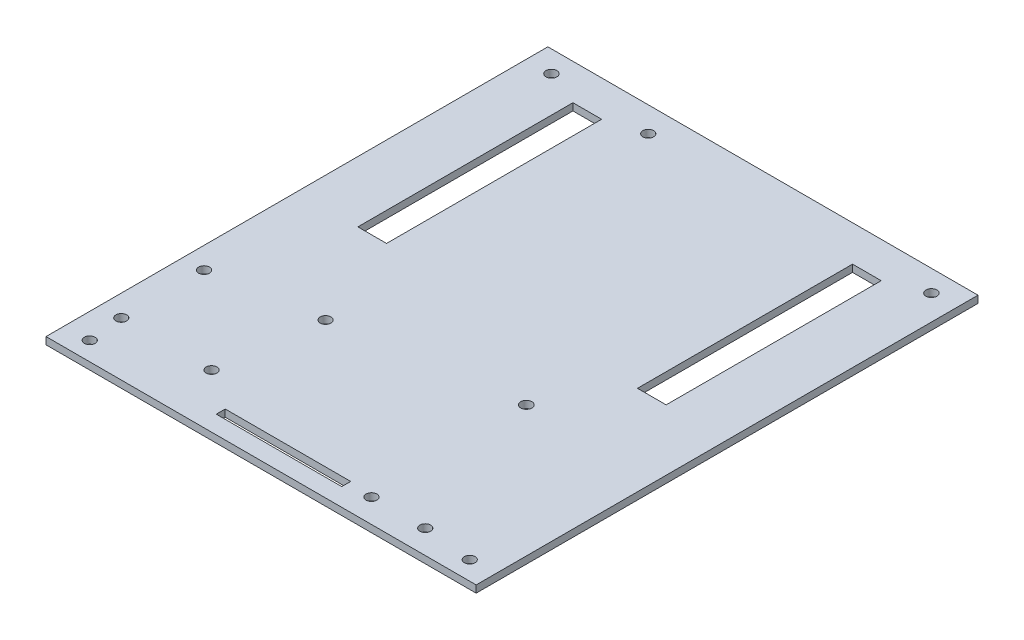
ISO-10303-21;
HEADER;
FILE_DESCRIPTION(('STEP AP214'),'2;1');
FILE_NAME('part.step','',(''),(''),'','','');
FILE_SCHEMA(('AUTOMOTIVE_DESIGN { 1 0 10303 214 1 1 1 1 }'));
ENDSEC;
DATA;
#1=APPLICATION_CONTEXT('core data for automotive mechanical design processes');
#2=APPLICATION_PROTOCOL_DEFINITION('international standard','automotive_design',2000,#1);
#3=PRODUCT_CONTEXT('',#1,'mechanical');
#4=PRODUCT('Part','Part','',(#3));
#5=PRODUCT_RELATED_PRODUCT_CATEGORY('part','',(#4));
#6=PRODUCT_DEFINITION_FORMATION('','',#4);
#7=PRODUCT_DEFINITION_CONTEXT('part definition',#1,'design');
#8=PRODUCT_DEFINITION('design','',#6,#7);
#9=PRODUCT_DEFINITION_SHAPE('','',#8);
#10=(LENGTH_UNIT() NAMED_UNIT(*) SI_UNIT(.MILLI.,.METRE.));
#11=(NAMED_UNIT(*) PLANE_ANGLE_UNIT() SI_UNIT($,.RADIAN.));
#12=(NAMED_UNIT(*) SI_UNIT($,.STERADIAN.) SOLID_ANGLE_UNIT());
#13=UNCERTAINTY_MEASURE_WITH_UNIT(LENGTH_MEASURE(1.E-05),#10,'distance_accuracy_value','');
#14=(GEOMETRIC_REPRESENTATION_CONTEXT(3) GLOBAL_UNCERTAINTY_ASSIGNED_CONTEXT((#13)) GLOBAL_UNIT_ASSIGNED_CONTEXT((#10,
#11,#12)) REPRESENTATION_CONTEXT('',''));
#15=CARTESIAN_POINT('',(0.,0.,0.));
#16=DIRECTION('',(0.,0.,1.));
#17=DIRECTION('',(1.,0.,0.));
#18=AXIS2_PLACEMENT_3D('',#15,#16,#17);
#19=CARTESIAN_POINT('',(-60.,2.,70.));
#20=DIRECTION('',(1.,0.,0.));
#21=DIRECTION('',(0.,0.,-1.));
#22=AXIS2_PLACEMENT_3D('',#19,#20,#21);
#23=PLANE('',#22);
#24=DIRECTION('',(0.,0.,1.));
#25=VECTOR('',#24,1.);
#26=CARTESIAN_POINT('',(-60.,0.,70.));
#27=LINE('',#26,#25);
#28=CARTESIAN_POINT('',(-60.,0.,-70.));
#29=VERTEX_POINT('',#28);
#30=CARTESIAN_POINT('',(-60.,0.,70.));
#31=VERTEX_POINT('',#30);
#32=EDGE_CURVE('E312',#29,#31,#27,.T.);
#33=ORIENTED_EDGE('',*,*,#32,.T.);
#34=DIRECTION('',(0.,-1.,0.));
#35=VECTOR('',#34,1.);
#36=CARTESIAN_POINT('',(-60.,2.,70.));
#37=LINE('',#36,#35);
#38=CARTESIAN_POINT('',(-60.,2.,70.));
#39=VERTEX_POINT('',#38);
#40=EDGE_CURVE('E11',#39,#31,#37,.T.);
#41=ORIENTED_EDGE('',*,*,#40,.F.);
#42=DIRECTION('',(0.,0.,1.));
#43=VECTOR('',#42,1.);
#44=CARTESIAN_POINT('',(-60.,2.,70.));
#45=LINE('',#44,#43);
#46=CARTESIAN_POINT('',(-60.,2.,-70.));
#47=VERTEX_POINT('',#46);
#48=EDGE_CURVE('E315',#47,#39,#45,.T.);
#49=ORIENTED_EDGE('',*,*,#48,.F.);
#50=DIRECTION('',(0.,-1.,0.));
#51=VECTOR('',#50,1.);
#52=CARTESIAN_POINT('',(-60.,2.,-70.));
#53=LINE('',#52,#51);
#54=EDGE_CURVE('E325',#47,#29,#53,.T.);
#55=ORIENTED_EDGE('',*,*,#54,.T.);
#56=EDGE_LOOP('',(#33,#41,#49,#55));
#57=FACE_BOUND('',#56,.T.);
#58=ADVANCED_FACE('F38',(#57),#23,.F.);
#59=CARTESIAN_POINT('',(60.,2.,70.));
#60=DIRECTION('',(0.,0.,-1.));
#61=DIRECTION('',(-1.,0.,0.));
#62=AXIS2_PLACEMENT_3D('',#59,#60,#61);
#63=PLANE('',#62);
#64=DIRECTION('',(1.,0.,0.));
#65=VECTOR('',#64,1.);
#66=CARTESIAN_POINT('',(60.,0.,70.));
#67=LINE('',#66,#65);
#68=CARTESIAN_POINT('',(60.,0.,70.));
#69=VERTEX_POINT('',#68);
#70=EDGE_CURVE('E328',#31,#69,#67,.T.);
#71=ORIENTED_EDGE('',*,*,#70,.T.);
#72=DIRECTION('',(0.,-1.,0.));
#73=VECTOR('',#72,1.);
#74=CARTESIAN_POINT('',(60.,2.,70.));
#75=LINE('',#74,#73);
#76=CARTESIAN_POINT('',(60.,2.,70.));
#77=VERTEX_POINT('',#76);
#78=EDGE_CURVE('E45',#77,#69,#75,.T.);
#79=ORIENTED_EDGE('',*,*,#78,.F.);
#80=DIRECTION('',(1.,0.,0.));
#81=VECTOR('',#80,1.);
#82=CARTESIAN_POINT('',(60.,2.,70.));
#83=LINE('',#82,#81);
#84=EDGE_CURVE('E318',#39,#77,#83,.T.);
#85=ORIENTED_EDGE('',*,*,#84,.F.);
#86=ORIENTED_EDGE('',*,*,#40,.T.);
#87=EDGE_LOOP('',(#71,#79,#85,#86));
#88=FACE_BOUND('',#87,.T.);
#89=ADVANCED_FACE('F357',(#88),#63,.F.);
#90=CARTESIAN_POINT('',(60.,2.,70.));
#91=DIRECTION('',(-1.,0.,0.));
#92=DIRECTION('',(0.,0.,1.));
#93=AXIS2_PLACEMENT_3D('',#90,#91,#92);
#94=PLANE('',#93);
#95=DIRECTION('',(0.,0.,-1.));
#96=VECTOR('',#95,1.);
#97=CARTESIAN_POINT('',(60.,0.,70.));
#98=LINE('',#97,#96);
#99=CARTESIAN_POINT('',(60.,0.,-70.));
#100=VERTEX_POINT('',#99);
#101=EDGE_CURVE('E330',#69,#100,#98,.T.);
#102=ORIENTED_EDGE('',*,*,#101,.T.);
#103=DIRECTION('',(0.,-1.,0.));
#104=VECTOR('',#103,1.);
#105=CARTESIAN_POINT('',(60.,2.,-70.));
#106=LINE('',#105,#104);
#107=CARTESIAN_POINT('',(60.,2.,-70.));
#108=VERTEX_POINT('',#107);
#109=EDGE_CURVE('E335',#108,#100,#106,.T.);
#110=ORIENTED_EDGE('',*,*,#109,.F.);
#111=DIRECTION('',(0.,0.,-1.));
#112=VECTOR('',#111,1.);
#113=CARTESIAN_POINT('',(60.,2.,70.));
#114=LINE('',#113,#112);
#115=EDGE_CURVE('E321',#77,#108,#114,.T.);
#116=ORIENTED_EDGE('',*,*,#115,.F.);
#117=ORIENTED_EDGE('',*,*,#78,.T.);
#118=EDGE_LOOP('',(#102,#110,#116,#117));
#119=FACE_BOUND('',#118,.T.);
#120=ADVANCED_FACE('F342',(#119),#94,.F.);
#121=CARTESIAN_POINT('',(60.,2.,-70.));
#122=DIRECTION('',(0.,0.,1.));
#123=DIRECTION('',(1.,0.,0.));
#124=AXIS2_PLACEMENT_3D('',#121,#122,#123);
#125=PLANE('',#124);
#126=DIRECTION('',(-1.,0.,0.));
#127=VECTOR('',#126,1.);
#128=CARTESIAN_POINT('',(60.,0.,-70.));
#129=LINE('',#128,#127);
#130=EDGE_CURVE('E319',#100,#29,#129,.T.);
#131=ORIENTED_EDGE('',*,*,#130,.T.);
#132=ORIENTED_EDGE('',*,*,#54,.F.);
#133=DIRECTION('',(-1.,0.,0.));
#134=VECTOR('',#133,1.);
#135=CARTESIAN_POINT('',(60.,2.,-70.));
#136=LINE('',#135,#134);
#137=EDGE_CURVE('E323',#108,#47,#136,.T.);
#138=ORIENTED_EDGE('',*,*,#137,.F.);
#139=ORIENTED_EDGE('',*,*,#109,.T.);
#140=EDGE_LOOP('',(#131,#132,#138,#139));
#141=FACE_BOUND('',#140,.T.);
#142=ADVANCED_FACE('F350',(#141),#125,.F.);
#143=CARTESIAN_POINT('',(0.,2.,0.));
#144=DIRECTION('',(0.,1.,0.));
#145=DIRECTION('',(0.,0.,1.));
#146=AXIS2_PLACEMENT_3D('',#143,#144,#145);
#147=PLANE('',#146);
#148=CARTESIAN_POINT('',(39.1835613736994,2.,63.3826398099015));
#149=DIRECTION('',(0.,1.,0.));
#150=DIRECTION('',(0.,0.,1.));
#151=AXIS2_PLACEMENT_3D('',#148,#149,#150);
#152=CIRCLE('',#151,1.5);
#153=CARTESIAN_POINT('',(39.1835613736994,2.,64.8826398099015));
#154=VERTEX_POINT('',#153);
#155=EDGE_CURVE('E471',#154,#154,#152,.T.);
#156=ORIENTED_EDGE('',*,*,#155,.F.);
#157=EDGE_LOOP('',(#156));
#158=FACE_BOUND('',#157,.T.);
#159=CARTESIAN_POINT('',(24.1835613736994,2.,63.3826398099015));
#160=DIRECTION('',(0.,1.,0.));
#161=DIRECTION('',(0.,0.,1.));
#162=AXIS2_PLACEMENT_3D('',#159,#160,#161);
#163=CIRCLE('',#162,1.5);
#164=CARTESIAN_POINT('',(24.1835613736994,2.,64.8826398099015));
#165=VERTEX_POINT('',#164);
#166=EDGE_CURVE('E174',#165,#165,#163,.T.);
#167=ORIENTED_EDGE('',*,*,#166,.F.);
#168=EDGE_LOOP('',(#167));
#169=FACE_BOUND('',#168,.T.);
#170=DIRECTION('',(0.,0.,1.));
#171=VECTOR('',#170,1.);
#172=CARTESIAN_POINT('',(-17.5,2.,65.));
#173=LINE('',#172,#171);
#174=CARTESIAN_POINT('',(-17.5,2.,62.5));
#175=VERTEX_POINT('',#174);
#176=CARTESIAN_POINT('',(-17.5,2.,65.));
#177=VERTEX_POINT('',#176);
#178=EDGE_CURVE('E52',#175,#177,#173,.T.);
#179=ORIENTED_EDGE('',*,*,#178,.F.);
#180=DIRECTION('',(-1.,0.,0.));
#181=VECTOR('',#180,1.);
#182=CARTESIAN_POINT('',(17.5,2.,62.5));
#183=LINE('',#182,#181);
#184=CARTESIAN_POINT('',(17.5,2.,62.5));
#185=VERTEX_POINT('',#184);
#186=EDGE_CURVE('E168',#185,#175,#183,.T.);
#187=ORIENTED_EDGE('',*,*,#186,.F.);
#188=DIRECTION('',(0.,0.,-1.));
#189=VECTOR('',#188,1.);
#190=CARTESIAN_POINT('',(17.5,2.,65.));
#191=LINE('',#190,#189);
#192=CARTESIAN_POINT('',(17.5,2.,65.));
#193=VERTEX_POINT('',#192);
#194=EDGE_CURVE('E171',#193,#185,#191,.T.);
#195=ORIENTED_EDGE('',*,*,#194,.F.);
#196=DIRECTION('',(1.,0.,0.));
#197=VECTOR('',#196,1.);
#198=CARTESIAN_POINT('',(17.5,2.,65.));
#199=LINE('',#198,#197);
#200=EDGE_CURVE('E180',#177,#193,#199,.T.);
#201=ORIENTED_EDGE('',*,*,#200,.F.);
#202=EDGE_LOOP('',(#179,#187,#195,#201));
#203=FACE_BOUND('',#202,.T.);
#204=CARTESIAN_POINT('',(-54.,2.,31.9));
#205=DIRECTION('',(0.,1.,0.));
#206=DIRECTION('',(0.,0.,1.));
#207=AXIS2_PLACEMENT_3D('',#204,#205,#206);
#208=CIRCLE('',#207,1.5);
#209=CARTESIAN_POINT('',(-54.,2.,33.4));
#210=VERTEX_POINT('',#209);
#211=EDGE_CURVE('E187',#210,#210,#208,.T.);
#212=ORIENTED_EDGE('',*,*,#211,.F.);
#213=EDGE_LOOP('',(#212));
#214=FACE_BOUND('',#213,.T.);
#215=CARTESIAN_POINT('',(-28.82,2.,55.));
#216=DIRECTION('',(0.,1.,0.));
#217=DIRECTION('',(0.,0.,1.));
#218=AXIS2_PLACEMENT_3D('',#215,#216,#217);
#219=CIRCLE('',#218,1.5);
#220=CARTESIAN_POINT('',(-28.82,2.,56.5));
#221=VERTEX_POINT('',#220);
#222=EDGE_CURVE('E194',#221,#221,#219,.T.);
#223=ORIENTED_EDGE('',*,*,#222,.F.);
#224=EDGE_LOOP('',(#223));
#225=FACE_BOUND('',#224,.T.);
#226=CARTESIAN_POINT('',(-54.,2.,55.));
#227=DIRECTION('',(0.,1.,0.));
#228=DIRECTION('',(0.,0.,1.));
#229=AXIS2_PLACEMENT_3D('',#226,#227,#228);
#230=CIRCLE('',#229,1.5);
#231=CARTESIAN_POINT('',(-54.,2.,56.5));
#232=VERTEX_POINT('',#231);
#233=EDGE_CURVE('E200',#232,#232,#230,.T.);
#234=ORIENTED_EDGE('',*,*,#233,.F.);
#235=EDGE_LOOP('',(#234));
#236=FACE_BOUND('',#235,.T.);
#237=DIRECTION('',(0.,0.,1.));
#238=VECTOR('',#237,1.);
#239=CARTESIAN_POINT('',(35.,2.,-60.));
#240=LINE('',#239,#238);
#241=CARTESIAN_POINT('',(35.,2.,-60.));
#242=VERTEX_POINT('',#241);
#243=CARTESIAN_POINT('',(35.,2.,0.));
#244=VERTEX_POINT('',#243);
#245=EDGE_CURVE('E206',#242,#244,#240,.T.);
#246=ORIENTED_EDGE('',*,*,#245,.F.);
#247=DIRECTION('',(-1.,0.,0.));
#248=VECTOR('',#247,1.);
#249=CARTESIAN_POINT('',(35.,2.,-60.));
#250=LINE('',#249,#248);
#251=CARTESIAN_POINT('',(43.,2.,-60.));
#252=VERTEX_POINT('',#251);
#253=EDGE_CURVE('E213',#252,#242,#250,.T.);
#254=ORIENTED_EDGE('',*,*,#253,.F.);
#255=DIRECTION('',(0.,0.,-1.));
#256=VECTOR('',#255,1.);
#257=CARTESIAN_POINT('',(43.,2.,-60.));
#258=LINE('',#257,#256);
#259=CARTESIAN_POINT('',(43.,2.,0.));
#260=VERTEX_POINT('',#259);
#261=EDGE_CURVE('E227',#260,#252,#258,.T.);
#262=ORIENTED_EDGE('',*,*,#261,.F.);
#263=DIRECTION('',(1.,0.,0.));
#264=VECTOR('',#263,1.);
#265=CARTESIAN_POINT('',(35.,2.,0.));
#266=LINE('',#265,#264);
#267=EDGE_CURVE('E224',#244,#260,#266,.T.);
#268=ORIENTED_EDGE('',*,*,#267,.F.);
#269=EDGE_LOOP('',(#246,#254,#262,#268));
#270=FACE_BOUND('',#269,.T.);
#271=DIRECTION('',(0.,0.,1.));
#272=VECTOR('',#271,1.);
#273=CARTESIAN_POINT('',(-43.,2.,-60.));
#274=LINE('',#273,#272);
#275=CARTESIAN_POINT('',(-43.,2.,-60.));
#276=VERTEX_POINT('',#275);
#277=CARTESIAN_POINT('',(-43.,2.,0.));
#278=VERTEX_POINT('',#277);
#279=EDGE_CURVE('E234',#276,#278,#274,.T.);
#280=ORIENTED_EDGE('',*,*,#279,.F.);
#281=DIRECTION('',(-1.,0.,0.));
#282=VECTOR('',#281,1.);
#283=CARTESIAN_POINT('',(-35.,2.,-60.));
#284=LINE('',#283,#282);
#285=CARTESIAN_POINT('',(-35.,2.,-60.));
#286=VERTEX_POINT('',#285);
#287=EDGE_CURVE('E245',#286,#276,#284,.T.);
#288=ORIENTED_EDGE('',*,*,#287,.F.);
#289=DIRECTION('',(0.,0.,-1.));
#290=VECTOR('',#289,1.);
#291=CARTESIAN_POINT('',(-35.,2.,-60.));
#292=LINE('',#291,#290);
#293=CARTESIAN_POINT('',(-35.,2.,0.));
#294=VERTEX_POINT('',#293);
#295=EDGE_CURVE('E259',#294,#286,#292,.T.);
#296=ORIENTED_EDGE('',*,*,#295,.F.);
#297=DIRECTION('',(1.,0.,0.));
#298=VECTOR('',#297,1.);
#299=CARTESIAN_POINT('',(-35.,2.,0.));
#300=LINE('',#299,#298);
#301=EDGE_CURVE('E256',#278,#294,#300,.T.);
#302=ORIENTED_EDGE('',*,*,#301,.F.);
#303=EDGE_LOOP('',(#280,#288,#296,#302));
#304=FACE_BOUND('',#303,.T.);
#305=CARTESIAN_POINT('',(23.5,2.,19.5));
#306=DIRECTION('',(0.,1.,0.));
#307=DIRECTION('',(0.,0.,1.));
#308=AXIS2_PLACEMENT_3D('',#305,#306,#307);
#309=CIRCLE('',#308,1.55);
#310=CARTESIAN_POINT('',(23.5,2.,21.05));
#311=VERTEX_POINT('',#310);
#312=EDGE_CURVE('E266',#311,#311,#309,.T.);
#313=ORIENTED_EDGE('',*,*,#312,.F.);
#314=EDGE_LOOP('',(#313));
#315=FACE_BOUND('',#314,.T.);
#316=CARTESIAN_POINT('',(-25.,2.,27.));
#317=DIRECTION('',(0.,1.,0.));
#318=DIRECTION('',(0.,0.,1.));
#319=AXIS2_PLACEMENT_3D('',#316,#317,#318);
#320=CIRCLE('',#319,1.5);
#321=CARTESIAN_POINT('',(-25.,2.,28.5));
#322=VERTEX_POINT('',#321);
#323=EDGE_CURVE('E276',#322,#322,#320,.T.);
#324=ORIENTED_EDGE('',*,*,#323,.F.);
#325=EDGE_LOOP('',(#324));
#326=FACE_BOUND('',#325,.T.);
#327=CARTESIAN_POINT('',(-25.,2.,-63.));
#328=DIRECTION('',(0.,1.,0.));
#329=DIRECTION('',(0.,0.,1.));
#330=AXIS2_PLACEMENT_3D('',#327,#328,#329);
#331=CIRCLE('',#330,1.5);
#332=CARTESIAN_POINT('',(-25.,2.,-61.5));
#333=VERTEX_POINT('',#332);
#334=EDGE_CURVE('E282',#333,#333,#331,.T.);
#335=ORIENTED_EDGE('',*,*,#334,.F.);
#336=EDGE_LOOP('',(#335));
#337=FACE_BOUND('',#336,.T.);
#338=CARTESIAN_POINT('',(53.,2.,64.8));
#339=DIRECTION('',(0.,1.,0.));
#340=DIRECTION('',(0.,0.,-1.));
#341=AXIS2_PLACEMENT_3D('',#338,#339,#340);
#342=CIRCLE('',#341,1.5);
#343=CARTESIAN_POINT('',(53.,2.,63.3));
#344=VERTEX_POINT('',#343);
#345=EDGE_CURVE('E288',#344,#344,#342,.T.);
#346=ORIENTED_EDGE('',*,*,#345,.F.);
#347=EDGE_LOOP('',(#346));
#348=FACE_BOUND('',#347,.T.);
#349=CARTESIAN_POINT('',(53.,2.,-64.));
#350=DIRECTION('',(0.,1.,0.));
#351=DIRECTION('',(0.,0.,-1.));
#352=AXIS2_PLACEMENT_3D('',#349,#350,#351);
#353=CIRCLE('',#352,1.525);
#354=CARTESIAN_POINT('',(53.,2.,-65.525));
#355=VERTEX_POINT('',#354);
#356=EDGE_CURVE('E294',#355,#355,#353,.T.);
#357=ORIENTED_EDGE('',*,*,#356,.F.);
#358=EDGE_LOOP('',(#357));
#359=FACE_BOUND('',#358,.T.);
#360=CARTESIAN_POINT('',(-53.,2.,64.8));
#361=DIRECTION('',(0.,1.,0.));
#362=DIRECTION('',(0.,0.,1.));
#363=AXIS2_PLACEMENT_3D('',#360,#361,#362);
#364=CIRCLE('',#363,1.5);
#365=CARTESIAN_POINT('',(-53.,2.,66.3));
#366=VERTEX_POINT('',#365);
#367=EDGE_CURVE('E300',#366,#366,#364,.T.);
#368=ORIENTED_EDGE('',*,*,#367,.F.);
#369=EDGE_LOOP('',(#368));
#370=FACE_BOUND('',#369,.T.);
#371=CARTESIAN_POINT('',(-53.,2.,-64.));
#372=DIRECTION('',(0.,1.,0.));
#373=DIRECTION('',(0.,0.,1.));
#374=AXIS2_PLACEMENT_3D('',#371,#372,#373);
#375=CIRCLE('',#374,1.525);
#376=CARTESIAN_POINT('',(-53.,2.,-62.475));
#377=VERTEX_POINT('',#376);
#378=EDGE_CURVE('E306',#377,#377,#375,.T.);
#379=ORIENTED_EDGE('',*,*,#378,.F.);
#380=EDGE_LOOP('',(#379));
#381=FACE_BOUND('',#380,.T.);
#382=ORIENTED_EDGE('',*,*,#48,.T.);
#383=ORIENTED_EDGE('',*,*,#84,.T.);
#384=ORIENTED_EDGE('',*,*,#115,.T.);
#385=ORIENTED_EDGE('',*,*,#137,.T.);
#386=EDGE_LOOP('',(#382,#383,#384,#385));
#387=FACE_BOUND('',#386,.T.);
#388=ADVANCED_FACE('F356',(#158,#169,#203,#214,#225,#236,#270,#304,#315,#326,#337,#348,#359,
#370,#381,#387),#147,.T.);
#389=CARTESIAN_POINT('',(0.,0.,0.));
#390=DIRECTION('',(0.,1.,0.));
#391=DIRECTION('',(0.,0.,1.));
#392=AXIS2_PLACEMENT_3D('',#389,#390,#391);
#393=PLANE('',#392);
#394=CARTESIAN_POINT('',(39.1835613736994,0.,63.3826398099015));
#395=DIRECTION('',(0.,1.,0.));
#396=DIRECTION('',(0.,0.,1.));
#397=AXIS2_PLACEMENT_3D('',#394,#395,#396);
#398=CIRCLE('',#397,1.5);
#399=CARTESIAN_POINT('',(39.1835613736994,0.,64.8826398099015));
#400=VERTEX_POINT('',#399);
#401=EDGE_CURVE('E468',#400,#400,#398,.T.);
#402=ORIENTED_EDGE('',*,*,#401,.T.);
#403=EDGE_LOOP('',(#402));
#404=FACE_BOUND('',#403,.T.);
#405=CARTESIAN_POINT('',(24.1835613736994,0.,63.3826398099015));
#406=DIRECTION('',(0.,1.,0.));
#407=DIRECTION('',(0.,0.,1.));
#408=AXIS2_PLACEMENT_3D('',#405,#406,#407);
#409=CIRCLE('',#408,1.5);
#410=CARTESIAN_POINT('',(24.1835613736994,0.,64.8826398099015));
#411=VERTEX_POINT('',#410);
#412=EDGE_CURVE('E181',#411,#411,#409,.T.);
#413=ORIENTED_EDGE('',*,*,#412,.T.);
#414=EDGE_LOOP('',(#413));
#415=FACE_BOUND('',#414,.T.);
#416=DIRECTION('',(-1.,0.,0.));
#417=VECTOR('',#416,1.);
#418=CARTESIAN_POINT('',(17.5,0.,62.5));
#419=LINE('',#418,#417);
#420=CARTESIAN_POINT('',(17.5,0.,62.5));
#421=VERTEX_POINT('',#420);
#422=CARTESIAN_POINT('',(-17.5,0.,62.5));
#423=VERTEX_POINT('',#422);
#424=EDGE_CURVE('E158',#421,#423,#419,.T.);
#425=ORIENTED_EDGE('',*,*,#424,.T.);
#426=DIRECTION('',(0.,0.,1.));
#427=VECTOR('',#426,1.);
#428=CARTESIAN_POINT('',(-17.5,0.,65.));
#429=LINE('',#428,#427);
#430=CARTESIAN_POINT('',(-17.5,0.,65.));
#431=VERTEX_POINT('',#430);
#432=EDGE_CURVE('E152',#423,#431,#429,.T.);
#433=ORIENTED_EDGE('',*,*,#432,.T.);
#434=DIRECTION('',(1.,0.,0.));
#435=VECTOR('',#434,1.);
#436=CARTESIAN_POINT('',(17.5,0.,65.));
#437=LINE('',#436,#435);
#438=CARTESIAN_POINT('',(17.5,0.,65.));
#439=VERTEX_POINT('',#438);
#440=EDGE_CURVE('E161',#431,#439,#437,.T.);
#441=ORIENTED_EDGE('',*,*,#440,.T.);
#442=DIRECTION('',(0.,0.,-1.));
#443=VECTOR('',#442,1.);
#444=CARTESIAN_POINT('',(17.5,0.,65.));
#445=LINE('',#444,#443);
#446=EDGE_CURVE('E60',#439,#421,#445,.T.);
#447=ORIENTED_EDGE('',*,*,#446,.T.);
#448=EDGE_LOOP('',(#425,#433,#441,#447));
#449=FACE_BOUND('',#448,.T.);
#450=CARTESIAN_POINT('',(-54.,0.,31.9));
#451=DIRECTION('',(0.,1.,0.));
#452=DIRECTION('',(0.,0.,1.));
#453=AXIS2_PLACEMENT_3D('',#450,#451,#452);
#454=CIRCLE('',#453,1.5);
#455=CARTESIAN_POINT('',(-54.,0.,33.4));
#456=VERTEX_POINT('',#455);
#457=EDGE_CURVE('E191',#456,#456,#454,.T.);
#458=ORIENTED_EDGE('',*,*,#457,.T.);
#459=EDGE_LOOP('',(#458));
#460=FACE_BOUND('',#459,.T.);
#461=CARTESIAN_POINT('',(-28.82,0.,55.));
#462=DIRECTION('',(0.,1.,0.));
#463=DIRECTION('',(0.,0.,1.));
#464=AXIS2_PLACEMENT_3D('',#461,#462,#463);
#465=CIRCLE('',#464,1.5);
#466=CARTESIAN_POINT('',(-28.82,0.,56.5));
#467=VERTEX_POINT('',#466);
#468=EDGE_CURVE('E197',#467,#467,#465,.T.);
#469=ORIENTED_EDGE('',*,*,#468,.T.);
#470=EDGE_LOOP('',(#469));
#471=FACE_BOUND('',#470,.T.);
#472=CARTESIAN_POINT('',(-54.,0.,55.));
#473=DIRECTION('',(0.,1.,0.));
#474=DIRECTION('',(0.,0.,1.));
#475=AXIS2_PLACEMENT_3D('',#472,#473,#474);
#476=CIRCLE('',#475,1.5);
#477=CARTESIAN_POINT('',(-54.,0.,56.5));
#478=VERTEX_POINT('',#477);
#479=EDGE_CURVE('E203',#478,#478,#476,.T.);
#480=ORIENTED_EDGE('',*,*,#479,.T.);
#481=EDGE_LOOP('',(#480));
#482=FACE_BOUND('',#481,.T.);
#483=DIRECTION('',(-1.,0.,0.));
#484=VECTOR('',#483,1.);
#485=CARTESIAN_POINT('',(35.,0.,-60.));
#486=LINE('',#485,#484);
#487=CARTESIAN_POINT('',(43.,0.,-60.));
#488=VERTEX_POINT('',#487);
#489=CARTESIAN_POINT('',(35.,0.,-60.));
#490=VERTEX_POINT('',#489);
#491=EDGE_CURVE('E219',#488,#490,#486,.T.);
#492=ORIENTED_EDGE('',*,*,#491,.T.);
#493=DIRECTION('',(0.,0.,1.));
#494=VECTOR('',#493,1.);
#495=CARTESIAN_POINT('',(35.,0.,-60.));
#496=LINE('',#495,#494);
#497=CARTESIAN_POINT('',(35.,0.,0.));
#498=VERTEX_POINT('',#497);
#499=EDGE_CURVE('E209',#490,#498,#496,.T.);
#500=ORIENTED_EDGE('',*,*,#499,.T.);
#501=DIRECTION('',(1.,0.,0.));
#502=VECTOR('',#501,1.);
#503=CARTESIAN_POINT('',(35.,0.,0.));
#504=LINE('',#503,#502);
#505=CARTESIAN_POINT('',(43.,0.,0.));
#506=VERTEX_POINT('',#505);
#507=EDGE_CURVE('E212',#498,#506,#504,.T.);
#508=ORIENTED_EDGE('',*,*,#507,.T.);
#509=DIRECTION('',(0.,0.,-1.));
#510=VECTOR('',#509,1.);
#511=CARTESIAN_POINT('',(43.,0.,-60.));
#512=LINE('',#511,#510);
#513=EDGE_CURVE('E216',#506,#488,#512,.T.);
#514=ORIENTED_EDGE('',*,*,#513,.T.);
#515=EDGE_LOOP('',(#492,#500,#508,#514));
#516=FACE_BOUND('',#515,.T.);
#517=DIRECTION('',(-1.,0.,0.));
#518=VECTOR('',#517,1.);
#519=CARTESIAN_POINT('',(-35.,0.,-60.));
#520=LINE('',#519,#518);
#521=CARTESIAN_POINT('',(-35.,0.,-60.));
#522=VERTEX_POINT('',#521);
#523=CARTESIAN_POINT('',(-43.,0.,-60.));
#524=VERTEX_POINT('',#523);
#525=EDGE_CURVE('E251',#522,#524,#520,.T.);
#526=ORIENTED_EDGE('',*,*,#525,.T.);
#527=DIRECTION('',(0.,0.,1.));
#528=VECTOR('',#527,1.);
#529=CARTESIAN_POINT('',(-43.,0.,-60.));
#530=LINE('',#529,#528);
#531=CARTESIAN_POINT('',(-43.,0.,0.));
#532=VERTEX_POINT('',#531);
#533=EDGE_CURVE('E241',#524,#532,#530,.T.);
#534=ORIENTED_EDGE('',*,*,#533,.T.);
#535=DIRECTION('',(1.,0.,0.));
#536=VECTOR('',#535,1.);
#537=CARTESIAN_POINT('',(-35.,0.,0.));
#538=LINE('',#537,#536);
#539=CARTESIAN_POINT('',(-35.,0.,0.));
#540=VERTEX_POINT('',#539);
#541=EDGE_CURVE('E244',#532,#540,#538,.T.);
#542=ORIENTED_EDGE('',*,*,#541,.T.);
#543=DIRECTION('',(0.,0.,-1.));
#544=VECTOR('',#543,1.);
#545=CARTESIAN_POINT('',(-35.,0.,-60.));
#546=LINE('',#545,#544);
#547=EDGE_CURVE('E248',#540,#522,#546,.T.);
#548=ORIENTED_EDGE('',*,*,#547,.T.);
#549=EDGE_LOOP('',(#526,#534,#542,#548));
#550=FACE_BOUND('',#549,.T.);
#551=CARTESIAN_POINT('',(23.5,0.,19.5));
#552=DIRECTION('',(0.,1.,0.));
#553=DIRECTION('',(0.,0.,1.));
#554=AXIS2_PLACEMENT_3D('',#551,#552,#553);
#555=CIRCLE('',#554,1.55);
#556=CARTESIAN_POINT('',(23.5,0.,21.05));
#557=VERTEX_POINT('',#556);
#558=EDGE_CURVE('E273',#557,#557,#555,.T.);
#559=ORIENTED_EDGE('',*,*,#558,.T.);
#560=EDGE_LOOP('',(#559));
#561=FACE_BOUND('',#560,.T.);
#562=CARTESIAN_POINT('',(-25.,0.,27.));
#563=DIRECTION('',(0.,1.,0.));
#564=DIRECTION('',(0.,0.,1.));
#565=AXIS2_PLACEMENT_3D('',#562,#563,#564);
#566=CIRCLE('',#565,1.5);
#567=CARTESIAN_POINT('',(-25.,0.,28.5));
#568=VERTEX_POINT('',#567);
#569=EDGE_CURVE('E279',#568,#568,#566,.T.);
#570=ORIENTED_EDGE('',*,*,#569,.T.);
#571=EDGE_LOOP('',(#570));
#572=FACE_BOUND('',#571,.T.);
#573=CARTESIAN_POINT('',(-25.,0.,-63.));
#574=DIRECTION('',(0.,1.,0.));
#575=DIRECTION('',(0.,0.,1.));
#576=AXIS2_PLACEMENT_3D('',#573,#574,#575);
#577=CIRCLE('',#576,1.5);
#578=CARTESIAN_POINT('',(-25.,0.,-61.5));
#579=VERTEX_POINT('',#578);
#580=EDGE_CURVE('E285',#579,#579,#577,.T.);
#581=ORIENTED_EDGE('',*,*,#580,.T.);
#582=EDGE_LOOP('',(#581));
#583=FACE_BOUND('',#582,.T.);
#584=CARTESIAN_POINT('',(53.,0.,64.8));
#585=DIRECTION('',(0.,1.,0.));
#586=DIRECTION('',(0.,0.,-1.));
#587=AXIS2_PLACEMENT_3D('',#584,#585,#586);
#588=CIRCLE('',#587,1.5);
#589=CARTESIAN_POINT('',(53.,0.,63.3));
#590=VERTEX_POINT('',#589);
#591=EDGE_CURVE('E291',#590,#590,#588,.T.);
#592=ORIENTED_EDGE('',*,*,#591,.T.);
#593=EDGE_LOOP('',(#592));
#594=FACE_BOUND('',#593,.T.);
#595=CARTESIAN_POINT('',(53.,0.,-64.));
#596=DIRECTION('',(0.,1.,0.));
#597=DIRECTION('',(0.,0.,-1.));
#598=AXIS2_PLACEMENT_3D('',#595,#596,#597);
#599=CIRCLE('',#598,1.525);
#600=CARTESIAN_POINT('',(53.,0.,-65.525));
#601=VERTEX_POINT('',#600);
#602=EDGE_CURVE('E297',#601,#601,#599,.T.);
#603=ORIENTED_EDGE('',*,*,#602,.T.);
#604=EDGE_LOOP('',(#603));
#605=FACE_BOUND('',#604,.T.);
#606=CARTESIAN_POINT('',(-53.,0.,64.8));
#607=DIRECTION('',(0.,1.,0.));
#608=DIRECTION('',(0.,0.,1.));
#609=AXIS2_PLACEMENT_3D('',#606,#607,#608);
#610=CIRCLE('',#609,1.5);
#611=CARTESIAN_POINT('',(-53.,0.,66.3));
#612=VERTEX_POINT('',#611);
#613=EDGE_CURVE('E303',#612,#612,#610,.T.);
#614=ORIENTED_EDGE('',*,*,#613,.T.);
#615=EDGE_LOOP('',(#614));
#616=FACE_BOUND('',#615,.T.);
#617=CARTESIAN_POINT('',(-53.,0.,-64.));
#618=DIRECTION('',(0.,1.,0.));
#619=DIRECTION('',(0.,0.,1.));
#620=AXIS2_PLACEMENT_3D('',#617,#618,#619);
#621=CIRCLE('',#620,1.525);
#622=CARTESIAN_POINT('',(-53.,0.,-62.475));
#623=VERTEX_POINT('',#622);
#624=EDGE_CURVE('E309',#623,#623,#621,.T.);
#625=ORIENTED_EDGE('',*,*,#624,.T.);
#626=EDGE_LOOP('',(#625));
#627=FACE_BOUND('',#626,.T.);
#628=ORIENTED_EDGE('',*,*,#32,.F.);
#629=ORIENTED_EDGE('',*,*,#130,.F.);
#630=ORIENTED_EDGE('',*,*,#101,.F.);
#631=ORIENTED_EDGE('',*,*,#70,.F.);
#632=EDGE_LOOP('',(#628,#629,#630,#631));
#633=FACE_BOUND('',#632,.T.);
#634=ADVANCED_FACE('F165',(#404,#415,#449,#460,#471,#482,#516,#550,#561,#572,#583,#594,#605,
#616,#627,#633),#393,.F.);
#635=CARTESIAN_POINT('',(-53.,0.,-64.));
#636=DIRECTION('',(0.,1.,0.));
#637=DIRECTION('',(0.,0.,1.));
#638=AXIS2_PLACEMENT_3D('',#635,#636,#637);
#639=CYLINDRICAL_SURFACE('',#638,1.525);
#640=ORIENTED_EDGE('',*,*,#624,.F.);
#641=EDGE_LOOP('',(#640));
#642=FACE_BOUND('',#641,.T.);
#643=ORIENTED_EDGE('',*,*,#378,.T.);
#644=EDGE_LOOP('',(#643));
#645=FACE_BOUND('',#644,.T.);
#646=ADVANCED_FACE('F369',(#642,#645),#639,.F.);
#647=CARTESIAN_POINT('',(-53.,0.,64.8));
#648=DIRECTION('',(0.,1.,0.));
#649=DIRECTION('',(0.,0.,1.));
#650=AXIS2_PLACEMENT_3D('',#647,#648,#649);
#651=CYLINDRICAL_SURFACE('',#650,1.5);
#652=ORIENTED_EDGE('',*,*,#613,.F.);
#653=EDGE_LOOP('',(#652));
#654=FACE_BOUND('',#653,.T.);
#655=ORIENTED_EDGE('',*,*,#367,.T.);
#656=EDGE_LOOP('',(#655));
#657=FACE_BOUND('',#656,.T.);
#658=ADVANCED_FACE('F376',(#654,#657),#651,.F.);
#659=CARTESIAN_POINT('',(53.,0.,-64.));
#660=DIRECTION('',(0.,1.,0.));
#661=DIRECTION('',(0.,0.,1.));
#662=AXIS2_PLACEMENT_3D('',#659,#660,#661);
#663=CYLINDRICAL_SURFACE('',#662,1.525);
#664=ORIENTED_EDGE('',*,*,#602,.F.);
#665=EDGE_LOOP('',(#664));
#666=FACE_BOUND('',#665,.T.);
#667=ORIENTED_EDGE('',*,*,#356,.T.);
#668=EDGE_LOOP('',(#667));
#669=FACE_BOUND('',#668,.T.);
#670=ADVANCED_FACE('F380',(#666,#669),#663,.F.);
#671=CARTESIAN_POINT('',(53.,0.,64.8));
#672=DIRECTION('',(0.,1.,0.));
#673=DIRECTION('',(0.,0.,1.));
#674=AXIS2_PLACEMENT_3D('',#671,#672,#673);
#675=CYLINDRICAL_SURFACE('',#674,1.5);
#676=ORIENTED_EDGE('',*,*,#591,.F.);
#677=EDGE_LOOP('',(#676));
#678=FACE_BOUND('',#677,.T.);
#679=ORIENTED_EDGE('',*,*,#345,.T.);
#680=EDGE_LOOP('',(#679));
#681=FACE_BOUND('',#680,.T.);
#682=ADVANCED_FACE('F384',(#678,#681),#675,.F.);
#683=CARTESIAN_POINT('',(-25.,0.,-63.));
#684=DIRECTION('',(0.,1.,0.));
#685=DIRECTION('',(0.,0.,1.));
#686=AXIS2_PLACEMENT_3D('',#683,#684,#685);
#687=CYLINDRICAL_SURFACE('',#686,1.5);
#688=ORIENTED_EDGE('',*,*,#580,.F.);
#689=EDGE_LOOP('',(#688));
#690=FACE_BOUND('',#689,.T.);
#691=ORIENTED_EDGE('',*,*,#334,.T.);
#692=EDGE_LOOP('',(#691));
#693=FACE_BOUND('',#692,.T.);
#694=ADVANCED_FACE('F388',(#690,#693),#687,.F.);
#695=CARTESIAN_POINT('',(-25.,0.,27.));
#696=DIRECTION('',(0.,1.,0.));
#697=DIRECTION('',(0.,0.,1.));
#698=AXIS2_PLACEMENT_3D('',#695,#696,#697);
#699=CYLINDRICAL_SURFACE('',#698,1.5);
#700=ORIENTED_EDGE('',*,*,#569,.F.);
#701=EDGE_LOOP('',(#700));
#702=FACE_BOUND('',#701,.T.);
#703=ORIENTED_EDGE('',*,*,#323,.T.);
#704=EDGE_LOOP('',(#703));
#705=FACE_BOUND('',#704,.T.);
#706=ADVANCED_FACE('F392',(#702,#705),#699,.F.);
#707=CARTESIAN_POINT('',(23.5,0.,19.5));
#708=DIRECTION('',(0.,1.,0.));
#709=DIRECTION('',(0.,0.,1.));
#710=AXIS2_PLACEMENT_3D('',#707,#708,#709);
#711=CYLINDRICAL_SURFACE('',#710,1.55);
#712=ORIENTED_EDGE('',*,*,#558,.F.);
#713=EDGE_LOOP('',(#712));
#714=FACE_BOUND('',#713,.T.);
#715=ORIENTED_EDGE('',*,*,#312,.T.);
#716=EDGE_LOOP('',(#715));
#717=FACE_BOUND('',#716,.T.);
#718=ADVANCED_FACE('F396',(#714,#717),#711,.F.);
#719=CARTESIAN_POINT('',(-43.,0.,-60.));
#720=DIRECTION('',(-1.,0.,0.));
#721=DIRECTION('',(0.,0.,1.));
#722=AXIS2_PLACEMENT_3D('',#719,#720,#721);
#723=PLANE('',#722);
#724=ORIENTED_EDGE('',*,*,#279,.T.);
#725=DIRECTION('',(0.,1.,0.));
#726=VECTOR('',#725,1.);
#727=CARTESIAN_POINT('',(-43.,0.,0.));
#728=LINE('',#727,#726);
#729=EDGE_CURVE('E254',#532,#278,#728,.T.);
#730=ORIENTED_EDGE('',*,*,#729,.F.);
#731=ORIENTED_EDGE('',*,*,#533,.F.);
#732=DIRECTION('',(0.,1.,0.));
#733=VECTOR('',#732,1.);
#734=CARTESIAN_POINT('',(-43.,0.,-60.));
#735=LINE('',#734,#733);
#736=EDGE_CURVE('E264',#524,#276,#735,.T.);
#737=ORIENTED_EDGE('',*,*,#736,.T.);
#738=EDGE_LOOP('',(#724,#730,#731,#737));
#739=FACE_BOUND('',#738,.T.);
#740=ADVANCED_FACE('F400',(#739),#723,.F.);
#741=CARTESIAN_POINT('',(-35.,0.,-60.));
#742=DIRECTION('',(0.,0.,-1.));
#743=DIRECTION('',(-1.,0.,0.));
#744=AXIS2_PLACEMENT_3D('',#741,#742,#743);
#745=PLANE('',#744);
#746=ORIENTED_EDGE('',*,*,#287,.T.);
#747=ORIENTED_EDGE('',*,*,#736,.F.);
#748=ORIENTED_EDGE('',*,*,#525,.F.);
#749=DIRECTION('',(0.,1.,0.));
#750=VECTOR('',#749,1.);
#751=CARTESIAN_POINT('',(-35.,0.,-60.));
#752=LINE('',#751,#750);
#753=EDGE_CURVE('E267',#522,#286,#752,.T.);
#754=ORIENTED_EDGE('',*,*,#753,.T.);
#755=EDGE_LOOP('',(#746,#747,#748,#754));
#756=FACE_BOUND('',#755,.T.);
#757=ADVANCED_FACE('F404',(#756),#745,.F.);
#758=CARTESIAN_POINT('',(-35.,0.,-60.));
#759=DIRECTION('',(1.,0.,0.));
#760=DIRECTION('',(0.,0.,-1.));
#761=AXIS2_PLACEMENT_3D('',#758,#759,#760);
#762=PLANE('',#761);
#763=ORIENTED_EDGE('',*,*,#295,.T.);
#764=ORIENTED_EDGE('',*,*,#753,.F.);
#765=ORIENTED_EDGE('',*,*,#547,.F.);
#766=DIRECTION('',(0.,1.,0.));
#767=VECTOR('',#766,1.);
#768=CARTESIAN_POINT('',(-35.,0.,0.));
#769=LINE('',#768,#767);
#770=EDGE_CURVE('E269',#540,#294,#769,.T.);
#771=ORIENTED_EDGE('',*,*,#770,.T.);
#772=EDGE_LOOP('',(#763,#764,#765,#771));
#773=FACE_BOUND('',#772,.T.);
#774=ADVANCED_FACE('F410',(#773),#762,.F.);
#775=CARTESIAN_POINT('',(-35.,0.,0.));
#776=DIRECTION('',(0.,0.,1.));
#777=DIRECTION('',(1.,0.,0.));
#778=AXIS2_PLACEMENT_3D('',#775,#776,#777);
#779=PLANE('',#778);
#780=ORIENTED_EDGE('',*,*,#301,.T.);
#781=ORIENTED_EDGE('',*,*,#770,.F.);
#782=ORIENTED_EDGE('',*,*,#541,.F.);
#783=ORIENTED_EDGE('',*,*,#729,.T.);
#784=EDGE_LOOP('',(#780,#781,#782,#783));
#785=FACE_BOUND('',#784,.T.);
#786=ADVANCED_FACE('F406',(#785),#779,.F.);
#787=CARTESIAN_POINT('',(35.,0.,-60.));
#788=DIRECTION('',(-1.,0.,0.));
#789=DIRECTION('',(0.,0.,1.));
#790=AXIS2_PLACEMENT_3D('',#787,#788,#789);
#791=PLANE('',#790);
#792=ORIENTED_EDGE('',*,*,#245,.T.);
#793=DIRECTION('',(0.,1.,0.));
#794=VECTOR('',#793,1.);
#795=CARTESIAN_POINT('',(35.,0.,0.));
#796=LINE('',#795,#794);
#797=EDGE_CURVE('E222',#498,#244,#796,.T.);
#798=ORIENTED_EDGE('',*,*,#797,.F.);
#799=ORIENTED_EDGE('',*,*,#499,.F.);
#800=DIRECTION('',(0.,1.,0.));
#801=VECTOR('',#800,1.);
#802=CARTESIAN_POINT('',(35.,0.,-60.));
#803=LINE('',#802,#801);
#804=EDGE_CURVE('E232',#490,#242,#803,.T.);
#805=ORIENTED_EDGE('',*,*,#804,.T.);
#806=EDGE_LOOP('',(#792,#798,#799,#805));
#807=FACE_BOUND('',#806,.T.);
#808=ADVANCED_FACE('F409',(#807),#791,.F.);
#809=CARTESIAN_POINT('',(35.,0.,-60.));
#810=DIRECTION('',(0.,0.,-1.));
#811=DIRECTION('',(-1.,0.,0.));
#812=AXIS2_PLACEMENT_3D('',#809,#810,#811);
#813=PLANE('',#812);
#814=ORIENTED_EDGE('',*,*,#253,.T.);
#815=ORIENTED_EDGE('',*,*,#804,.F.);
#816=ORIENTED_EDGE('',*,*,#491,.F.);
#817=DIRECTION('',(0.,1.,0.));
#818=VECTOR('',#817,1.);
#819=CARTESIAN_POINT('',(43.,0.,-60.));
#820=LINE('',#819,#818);
#821=EDGE_CURVE('E235',#488,#252,#820,.T.);
#822=ORIENTED_EDGE('',*,*,#821,.T.);
#823=EDGE_LOOP('',(#814,#815,#816,#822));
#824=FACE_BOUND('',#823,.T.);
#825=ADVANCED_FACE('F420',(#824),#813,.F.);
#826=CARTESIAN_POINT('',(43.,0.,-60.));
#827=DIRECTION('',(1.,0.,0.));
#828=DIRECTION('',(0.,0.,-1.));
#829=AXIS2_PLACEMENT_3D('',#826,#827,#828);
#830=PLANE('',#829);
#831=ORIENTED_EDGE('',*,*,#261,.T.);
#832=ORIENTED_EDGE('',*,*,#821,.F.);
#833=ORIENTED_EDGE('',*,*,#513,.F.);
#834=DIRECTION('',(0.,1.,0.));
#835=VECTOR('',#834,1.);
#836=CARTESIAN_POINT('',(43.,0.,0.));
#837=LINE('',#836,#835);
#838=EDGE_CURVE('E237',#506,#260,#837,.T.);
#839=ORIENTED_EDGE('',*,*,#838,.T.);
#840=EDGE_LOOP('',(#831,#832,#833,#839));
#841=FACE_BOUND('',#840,.T.);
#842=ADVANCED_FACE('F426',(#841),#830,.F.);
#843=CARTESIAN_POINT('',(35.,0.,0.));
#844=DIRECTION('',(0.,0.,1.));
#845=DIRECTION('',(1.,0.,0.));
#846=AXIS2_PLACEMENT_3D('',#843,#844,#845);
#847=PLANE('',#846);
#848=ORIENTED_EDGE('',*,*,#267,.T.);
#849=ORIENTED_EDGE('',*,*,#838,.F.);
#850=ORIENTED_EDGE('',*,*,#507,.F.);
#851=ORIENTED_EDGE('',*,*,#797,.T.);
#852=EDGE_LOOP('',(#848,#849,#850,#851));
#853=FACE_BOUND('',#852,.T.);
#854=ADVANCED_FACE('F422',(#853),#847,.F.);
#855=CARTESIAN_POINT('',(-54.,0.,55.));
#856=DIRECTION('',(0.,1.,0.));
#857=DIRECTION('',(0.,0.,1.));
#858=AXIS2_PLACEMENT_3D('',#855,#856,#857);
#859=CYLINDRICAL_SURFACE('',#858,1.5);
#860=ORIENTED_EDGE('',*,*,#479,.F.);
#861=EDGE_LOOP('',(#860));
#862=FACE_BOUND('',#861,.T.);
#863=ORIENTED_EDGE('',*,*,#233,.T.);
#864=EDGE_LOOP('',(#863));
#865=FACE_BOUND('',#864,.T.);
#866=ADVANCED_FACE('F425',(#862,#865),#859,.F.);
#867=CARTESIAN_POINT('',(-28.82,0.,55.));
#868=DIRECTION('',(0.,1.,0.));
#869=DIRECTION('',(0.,0.,1.));
#870=AXIS2_PLACEMENT_3D('',#867,#868,#869);
#871=CYLINDRICAL_SURFACE('',#870,1.5);
#872=ORIENTED_EDGE('',*,*,#468,.F.);
#873=EDGE_LOOP('',(#872));
#874=FACE_BOUND('',#873,.T.);
#875=ORIENTED_EDGE('',*,*,#222,.T.);
#876=EDGE_LOOP('',(#875));
#877=FACE_BOUND('',#876,.T.);
#878=ADVANCED_FACE('F436',(#874,#877),#871,.F.);
#879=CARTESIAN_POINT('',(-54.,0.,31.9));
#880=DIRECTION('',(0.,1.,0.));
#881=DIRECTION('',(0.,0.,1.));
#882=AXIS2_PLACEMENT_3D('',#879,#880,#881);
#883=CYLINDRICAL_SURFACE('',#882,1.5);
#884=ORIENTED_EDGE('',*,*,#457,.F.);
#885=EDGE_LOOP('',(#884));
#886=FACE_BOUND('',#885,.T.);
#887=ORIENTED_EDGE('',*,*,#211,.T.);
#888=EDGE_LOOP('',(#887));
#889=FACE_BOUND('',#888,.T.);
#890=ADVANCED_FACE('F440',(#886,#889),#883,.F.);
#891=CARTESIAN_POINT('',(-17.5,0.,65.));
#892=DIRECTION('',(-1.,0.,0.));
#893=DIRECTION('',(0.,0.,1.));
#894=AXIS2_PLACEMENT_3D('',#891,#892,#893);
#895=PLANE('',#894);
#896=ORIENTED_EDGE('',*,*,#178,.T.);
#897=DIRECTION('',(0.,1.,0.));
#898=VECTOR('',#897,1.);
#899=CARTESIAN_POINT('',(-17.5,0.,65.));
#900=LINE('',#899,#898);
#901=EDGE_CURVE('E148',#431,#177,#900,.T.);
#902=ORIENTED_EDGE('',*,*,#901,.F.);
#903=ORIENTED_EDGE('',*,*,#432,.F.);
#904=DIRECTION('',(0.,1.,0.));
#905=VECTOR('',#904,1.);
#906=CARTESIAN_POINT('',(-17.5,0.,62.5));
#907=LINE('',#906,#905);
#908=EDGE_CURVE('E185',#423,#175,#907,.T.);
#909=ORIENTED_EDGE('',*,*,#908,.T.);
#910=EDGE_LOOP('',(#896,#902,#903,#909));
#911=FACE_BOUND('',#910,.T.);
#912=ADVANCED_FACE('F150',(#911),#895,.F.);
#913=CARTESIAN_POINT('',(17.5,0.,62.5));
#914=DIRECTION('',(0.,0.,-1.));
#915=DIRECTION('',(-1.,0.,0.));
#916=AXIS2_PLACEMENT_3D('',#913,#914,#915);
#917=PLANE('',#916);
#918=ORIENTED_EDGE('',*,*,#186,.T.);
#919=ORIENTED_EDGE('',*,*,#908,.F.);
#920=ORIENTED_EDGE('',*,*,#424,.F.);
#921=DIRECTION('',(0.,1.,0.));
#922=VECTOR('',#921,1.);
#923=CARTESIAN_POINT('',(17.5,0.,62.5));
#924=LINE('',#923,#922);
#925=EDGE_CURVE('E188',#421,#185,#924,.T.);
#926=ORIENTED_EDGE('',*,*,#925,.T.);
#927=EDGE_LOOP('',(#918,#919,#920,#926));
#928=FACE_BOUND('',#927,.T.);
#929=ADVANCED_FACE('F447',(#928),#917,.F.);
#930=CARTESIAN_POINT('',(17.5,0.,65.));
#931=DIRECTION('',(1.,0.,0.));
#932=DIRECTION('',(0.,0.,-1.));
#933=AXIS2_PLACEMENT_3D('',#930,#931,#932);
#934=PLANE('',#933);
#935=ORIENTED_EDGE('',*,*,#194,.T.);
#936=ORIENTED_EDGE('',*,*,#925,.F.);
#937=ORIENTED_EDGE('',*,*,#446,.F.);
#938=DIRECTION('',(0.,1.,0.));
#939=VECTOR('',#938,1.);
#940=CARTESIAN_POINT('',(17.5,0.,65.));
#941=LINE('',#940,#939);
#942=EDGE_CURVE('E157',#439,#193,#941,.T.);
#943=ORIENTED_EDGE('',*,*,#942,.T.);
#944=EDGE_LOOP('',(#935,#936,#937,#943));
#945=FACE_BOUND('',#944,.T.);
#946=ADVANCED_FACE('F451',(#945),#934,.F.);
#947=CARTESIAN_POINT('',(17.5,0.,65.));
#948=DIRECTION('',(0.,0.,1.));
#949=DIRECTION('',(1.,0.,0.));
#950=AXIS2_PLACEMENT_3D('',#947,#948,#949);
#951=PLANE('',#950);
#952=ORIENTED_EDGE('',*,*,#200,.T.);
#953=ORIENTED_EDGE('',*,*,#942,.F.);
#954=ORIENTED_EDGE('',*,*,#440,.F.);
#955=ORIENTED_EDGE('',*,*,#901,.T.);
#956=EDGE_LOOP('',(#952,#953,#954,#955));
#957=FACE_BOUND('',#956,.T.);
#958=ADVANCED_FACE('F162',(#957),#951,.F.);
#959=CARTESIAN_POINT('',(24.1835613736994,0.,63.3826398099015));
#960=DIRECTION('',(0.,1.,0.));
#961=DIRECTION('',(0.,0.,1.));
#962=AXIS2_PLACEMENT_3D('',#959,#960,#961);
#963=CYLINDRICAL_SURFACE('',#962,1.5);
#964=ORIENTED_EDGE('',*,*,#412,.F.);
#965=EDGE_LOOP('',(#964));
#966=FACE_BOUND('',#965,.T.);
#967=ORIENTED_EDGE('',*,*,#166,.T.);
#968=EDGE_LOOP('',(#967));
#969=FACE_BOUND('',#968,.T.);
#970=ADVANCED_FACE('F450',(#966,#969),#963,.F.);
#971=CARTESIAN_POINT('',(39.1835613736994,0.,63.3826398099015));
#972=DIRECTION('',(0.,1.,0.));
#973=DIRECTION('',(0.,0.,1.));
#974=AXIS2_PLACEMENT_3D('',#971,#972,#973);
#975=CYLINDRICAL_SURFACE('',#974,1.5);
#976=ORIENTED_EDGE('',*,*,#401,.F.);
#977=EDGE_LOOP('',(#976));
#978=FACE_BOUND('',#977,.T.);
#979=ORIENTED_EDGE('',*,*,#155,.T.);
#980=EDGE_LOOP('',(#979));
#981=FACE_BOUND('',#980,.T.);
#982=ADVANCED_FACE('F459',(#978,#981),#975,.F.);
#983=CLOSED_SHELL('',(#58,#89,#120,#142,#388,#634,#646,#658,#670,#682,#694,#706,#718,#740,#757,
#774,#786,#808,#825,#842,#854,#866,#878,#890,#912,#929,#946,#958,#970,#982));
#984=MANIFOLD_SOLID_BREP('B2',#983);
#985=ADVANCED_BREP_SHAPE_REPRESENTATION('',(#18,#984),#14);
#986=SHAPE_DEFINITION_REPRESENTATION(#9,#985);
ENDSEC;
END-ISO-10303-21;
